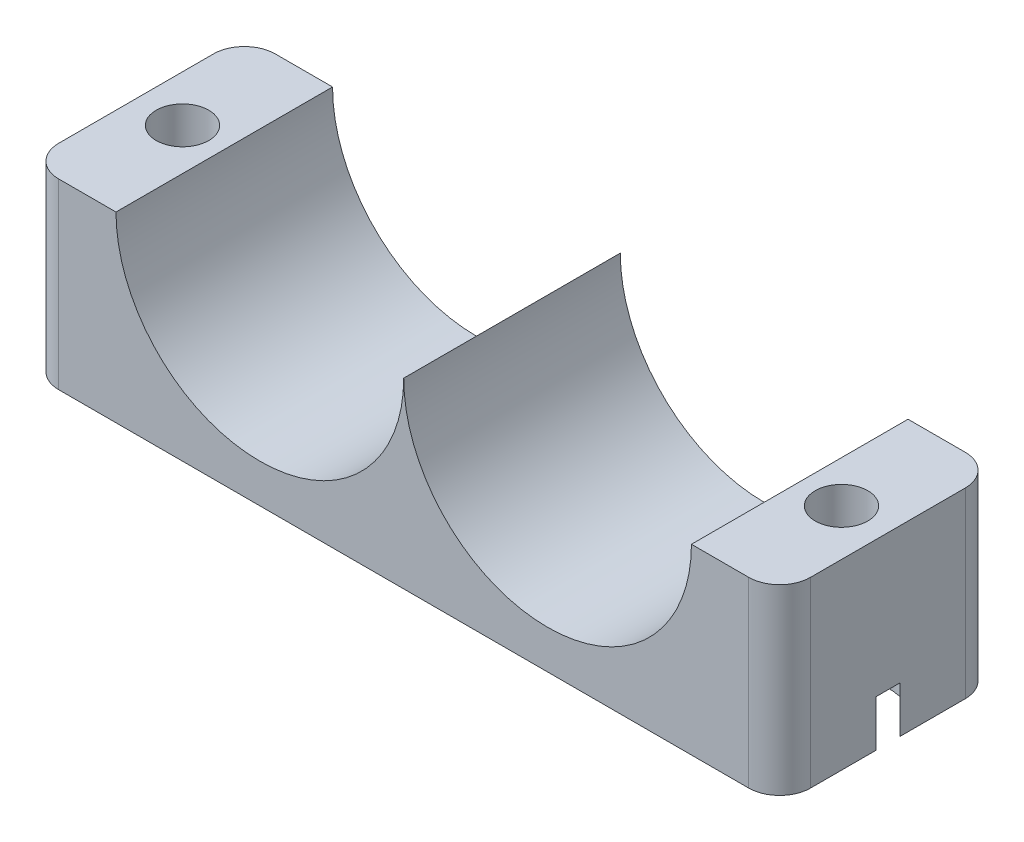
ISO-10303-21;
HEADER;
FILE_DESCRIPTION(('STEP AP214'),'2;1');
FILE_NAME('part.step','',(''),(''),'','','');
FILE_SCHEMA(('AUTOMOTIVE_DESIGN { 1 0 10303 214 1 1 1 1 }'));
ENDSEC;
DATA;
#1=APPLICATION_CONTEXT('core data for automotive mechanical design processes');
#2=APPLICATION_PROTOCOL_DEFINITION('international standard','automotive_design',2000,#1);
#3=PRODUCT_CONTEXT('',#1,'mechanical');
#4=PRODUCT('Part','Part','',(#3));
#5=PRODUCT_RELATED_PRODUCT_CATEGORY('part','',(#4));
#6=PRODUCT_DEFINITION_FORMATION('','',#4);
#7=PRODUCT_DEFINITION_CONTEXT('part definition',#1,'design');
#8=PRODUCT_DEFINITION('design','',#6,#7);
#9=PRODUCT_DEFINITION_SHAPE('','',#8);
#10=(LENGTH_UNIT() NAMED_UNIT(*) SI_UNIT(.MILLI.,.METRE.));
#11=(NAMED_UNIT(*) PLANE_ANGLE_UNIT() SI_UNIT($,.RADIAN.));
#12=(NAMED_UNIT(*) SI_UNIT($,.STERADIAN.) SOLID_ANGLE_UNIT());
#13=UNCERTAINTY_MEASURE_WITH_UNIT(LENGTH_MEASURE(1.E-05),#10,'distance_accuracy_value','');
#14=(GEOMETRIC_REPRESENTATION_CONTEXT(3) GLOBAL_UNCERTAINTY_ASSIGNED_CONTEXT((#13)) GLOBAL_UNIT_ASSIGNED_CONTEXT((#10,
#11,#12)) REPRESENTATION_CONTEXT('',''));
#15=CARTESIAN_POINT('',(0.,0.,0.));
#16=DIRECTION('',(0.,0.,1.));
#17=DIRECTION('',(1.,0.,0.));
#18=AXIS2_PLACEMENT_3D('',#15,#16,#17);
#19=CARTESIAN_POINT('',(158.1,491.59,478.72));
#20=DIRECTION('',(0.,-1.,0.));
#21=DIRECTION('',(1.,0.,0.));
#22=AXIS2_PLACEMENT_3D('',#19,#20,#21);
#23=CYLINDRICAL_SURFACE('',#22,1.7);
#24=DIRECTION('',(0.,1.,0.));
#25=VECTOR('',#24,1.);
#26=CARTESIAN_POINT('',(159.8,491.59,478.72));
#27=LINE('',#26,#25);
#28=CARTESIAN_POINT('',(159.8,495.59,478.72));
#29=VERTEX_POINT('',#28);
#30=CARTESIAN_POINT('',(159.8,504.39,478.72));
#31=VERTEX_POINT('',#30);
#32=EDGE_CURVE('E9',#29,#31,#27,.T.);
#33=ORIENTED_EDGE('',*,*,#32,.T.);
#34=CARTESIAN_POINT('',(158.1,504.39,478.72));
#35=DIRECTION('',(0.,-1.,0.));
#36=DIRECTION('',(1.,0.,0.));
#37=AXIS2_PLACEMENT_3D('',#34,#35,#36);
#38=CIRCLE('',#37,1.7);
#39=EDGE_CURVE('E232',#31,#31,#38,.T.);
#40=ORIENTED_EDGE('',*,*,#39,.F.);
#41=ORIENTED_EDGE('',*,*,#32,.F.);
#42=CARTESIAN_POINT('',(158.1,495.59,478.72));
#43=DIRECTION('',(0.,-1.,0.));
#44=DIRECTION('',(1.,0.,0.));
#45=AXIS2_PLACEMENT_3D('',#42,#43,#44);
#46=CIRCLE('',#45,1.7);
#47=EDGE_CURVE('E24',#29,#29,#46,.T.);
#48=ORIENTED_EDGE('',*,*,#47,.T.);
#49=EDGE_LOOP('',(#33,#40,#41,#48));
#50=FACE_BOUND('',#49,.T.);
#51=ADVANCED_FACE('F15',(#50),#23,.F.);
#52=CARTESIAN_POINT('',(158.1,495.59,478.72));
#53=DIRECTION('',(0.,-1.,0.));
#54=DIRECTION('',(0.,0.,-1.));
#55=AXIS2_PLACEMENT_3D('',#52,#53,#54);
#56=PLANE('',#55);
#57=ORIENTED_EDGE('',*,*,#47,.F.);
#58=EDGE_LOOP('',(#57));
#59=FACE_BOUND('',#58,.T.);
#60=DIRECTION('',(0.,0.,-1.));
#61=VECTOR('',#60,1.);
#62=CARTESIAN_POINT('',(161.1,495.59,475.22));
#63=LINE('',#62,#61);
#64=CARTESIAN_POINT('',(161.1,495.59,479.50102496759));
#65=VERTEX_POINT('',#64);
#66=CARTESIAN_POINT('',(161.1,495.59,477.9389750324));
#67=VERTEX_POINT('',#66);
#68=EDGE_CURVE('E183',#65,#67,#63,.T.);
#69=ORIENTED_EDGE('',*,*,#68,.F.);
#70=CARTESIAN_POINT('',(158.1,495.59,478.72));
#71=DIRECTION('',(0.,-1.,0.));
#72=DIRECTION('',(1.,0.,0.));
#73=AXIS2_PLACEMENT_3D('',#70,#71,#72);
#74=CIRCLE('',#73,3.1);
#75=EDGE_CURVE('E222',#65,#67,#74,.T.);
#76=ORIENTED_EDGE('',*,*,#75,.T.);
#77=EDGE_LOOP('',(#69,#76));
#78=FACE_BOUND('',#77,.T.);
#79=ADVANCED_FACE('F250',(#59,#78),#56,.T.);
#80=CARTESIAN_POINT('',(112.5,504.39,471.72));
#81=DIRECTION('',(0.,1.,0.));
#82=DIRECTION('',(1.,0.,0.));
#83=AXIS2_PLACEMENT_3D('',#80,#81,#82);
#84=PLANE('',#83);
#85=ORIENTED_EDGE('',*,*,#39,.T.);
#86=EDGE_LOOP('',(#85));
#87=FACE_BOUND('',#86,.T.);
#88=DIRECTION('',(1.,0.,0.));
#89=VECTOR('',#88,1.);
#90=CARTESIAN_POINT('',(112.5,504.39,471.72));
#91=LINE('',#90,#89);
#92=CARTESIAN_POINT('',(155.4,504.39,471.72));
#93=VERTEX_POINT('',#92);
#94=CARTESIAN_POINT('',(159.1,504.39,471.72));
#95=VERTEX_POINT('',#94);
#96=EDGE_CURVE('E155',#93,#95,#91,.T.);
#97=ORIENTED_EDGE('',*,*,#96,.F.);
#98=DIRECTION('',(0.,0.,1.));
#99=VECTOR('',#98,1.);
#100=CARTESIAN_POINT('',(155.4,504.39,464.72));
#101=LINE('',#100,#99);
#102=CARTESIAN_POINT('',(155.4,504.39,485.72));
#103=VERTEX_POINT('',#102);
#104=EDGE_CURVE('E86',#93,#103,#101,.T.);
#105=ORIENTED_EDGE('',*,*,#104,.T.);
#106=DIRECTION('',(1.,0.,0.));
#107=VECTOR('',#106,1.);
#108=CARTESIAN_POINT('',(112.5,504.39,485.72));
#109=LINE('',#108,#107);
#110=CARTESIAN_POINT('',(159.1,504.39,485.72));
#111=VERTEX_POINT('',#110);
#112=EDGE_CURVE('E81',#103,#111,#109,.T.);
#113=ORIENTED_EDGE('',*,*,#112,.T.);
#114=CARTESIAN_POINT('',(159.1,504.39,483.72));
#115=DIRECTION('',(0.,-1.,0.));
#116=DIRECTION('',(0.,0.,1.));
#117=AXIS2_PLACEMENT_3D('',#114,#115,#116);
#118=CIRCLE('',#117,2.);
#119=CARTESIAN_POINT('',(161.1,504.39,483.72));
#120=VERTEX_POINT('',#119);
#121=EDGE_CURVE('E225',#120,#111,#118,.T.);
#122=ORIENTED_EDGE('',*,*,#121,.F.);
#123=DIRECTION('',(0.,0.,1.));
#124=VECTOR('',#123,1.);
#125=CARTESIAN_POINT('',(161.1,504.39,471.72));
#126=LINE('',#125,#124);
#127=CARTESIAN_POINT('',(161.1,504.39,473.72));
#128=VERTEX_POINT('',#127);
#129=EDGE_CURVE('E197',#128,#120,#126,.T.);
#130=ORIENTED_EDGE('',*,*,#129,.F.);
#131=CARTESIAN_POINT('',(159.1,504.39,473.72));
#132=DIRECTION('',(0.,1.,0.));
#133=DIRECTION('',(0.,0.,1.));
#134=AXIS2_PLACEMENT_3D('',#131,#132,#133);
#135=CIRCLE('',#134,2.);
#136=EDGE_CURVE('E209',#128,#95,#135,.T.);
#137=ORIENTED_EDGE('',*,*,#136,.T.);
#138=EDGE_LOOP('',(#97,#105,#113,#122,#130,#137));
#139=FACE_BOUND('',#138,.T.);
#140=ADVANCED_FACE('F247',(#87,#139),#84,.T.);
#141=CARTESIAN_POINT('',(146.1,504.39,464.72));
#142=DIRECTION('',(0.,0.,-1.));
#143=DIRECTION('',(1.,0.,0.));
#144=AXIS2_PLACEMENT_3D('',#141,#142,#143);
#145=CYLINDRICAL_SURFACE('',#144,9.3);
#146=ORIENTED_EDGE('',*,*,#104,.F.);
#147=CARTESIAN_POINT('',(146.1,504.39,471.72));
#148=DIRECTION('',(0.,0.,-1.));
#149=DIRECTION('',(1.,0.,0.));
#150=AXIS2_PLACEMENT_3D('',#147,#148,#149);
#151=CIRCLE('',#150,9.3);
#152=CARTESIAN_POINT('',(136.8,504.39,471.72));
#153=VERTEX_POINT('',#152);
#154=EDGE_CURVE('E206',#93,#153,#151,.T.);
#155=ORIENTED_EDGE('',*,*,#154,.T.);
#156=DIRECTION('',(0.,0.,1.));
#157=VECTOR('',#156,1.);
#158=CARTESIAN_POINT('',(136.8,504.39,464.72));
#159=LINE('',#158,#157);
#160=CARTESIAN_POINT('',(136.8,504.39,485.72));
#161=VERTEX_POINT('',#160);
#162=EDGE_CURVE('E96',#153,#161,#159,.T.);
#163=ORIENTED_EDGE('',*,*,#162,.T.);
#164=CARTESIAN_POINT('',(146.1,504.39,485.72));
#165=DIRECTION('',(0.,0.,-1.));
#166=DIRECTION('',(1.,0.,0.));
#167=AXIS2_PLACEMENT_3D('',#164,#165,#166);
#168=CIRCLE('',#167,9.3);
#169=EDGE_CURVE('E235',#103,#161,#168,.T.);
#170=ORIENTED_EDGE('',*,*,#169,.F.);
#171=EDGE_LOOP('',(#146,#155,#163,#170));
#172=FACE_BOUND('',#171,.T.);
#173=ADVANCED_FACE('F410',(#172),#145,.F.);
#174=CARTESIAN_POINT('',(127.5,504.39,464.72));
#175=DIRECTION('',(0.,0.,-1.));
#176=DIRECTION('',(1.,0.,0.));
#177=AXIS2_PLACEMENT_3D('',#174,#175,#176);
#178=CYLINDRICAL_SURFACE('',#177,9.3);
#179=ORIENTED_EDGE('',*,*,#162,.F.);
#180=CARTESIAN_POINT('',(127.5,504.39,471.72));
#181=DIRECTION('',(0.,0.,-1.));
#182=DIRECTION('',(1.,0.,0.));
#183=AXIS2_PLACEMENT_3D('',#180,#181,#182);
#184=CIRCLE('',#183,9.3);
#185=CARTESIAN_POINT('',(118.2,504.39,471.72));
#186=VERTEX_POINT('',#185);
#187=EDGE_CURVE('E135',#153,#186,#184,.T.);
#188=ORIENTED_EDGE('',*,*,#187,.T.);
#189=DIRECTION('',(0.,0.,-1.));
#190=VECTOR('',#189,1.);
#191=CARTESIAN_POINT('',(118.2,504.39,464.72));
#192=LINE('',#191,#190);
#193=CARTESIAN_POINT('',(118.2,504.39,485.72));
#194=VERTEX_POINT('',#193);
#195=EDGE_CURVE('E173',#194,#186,#192,.T.);
#196=ORIENTED_EDGE('',*,*,#195,.F.);
#197=CARTESIAN_POINT('',(127.5,504.39,485.72));
#198=DIRECTION('',(0.,0.,-1.));
#199=DIRECTION('',(1.,0.,0.));
#200=AXIS2_PLACEMENT_3D('',#197,#198,#199);
#201=CIRCLE('',#200,9.3);
#202=EDGE_CURVE('E239',#161,#194,#201,.T.);
#203=ORIENTED_EDGE('',*,*,#202,.F.);
#204=EDGE_LOOP('',(#179,#188,#196,#203));
#205=FACE_BOUND('',#204,.T.);
#206=ADVANCED_FACE('F408',(#205),#178,.F.);
#207=CARTESIAN_POINT('',(115.5,491.59,478.72));
#208=DIRECTION('',(0.,-1.,0.));
#209=DIRECTION('',(1.,0.,0.));
#210=AXIS2_PLACEMENT_3D('',#207,#208,#209);
#211=CYLINDRICAL_SURFACE('',#210,1.7);
#212=DIRECTION('',(0.,1.,0.));
#213=VECTOR('',#212,1.);
#214=CARTESIAN_POINT('',(117.2,491.59,478.72));
#215=LINE('',#214,#213);
#216=CARTESIAN_POINT('',(117.2,495.59,478.72));
#217=VERTEX_POINT('',#216);
#218=CARTESIAN_POINT('',(117.2,504.39,478.72));
#219=VERTEX_POINT('',#218);
#220=EDGE_CURVE('E349',#217,#219,#215,.T.);
#221=ORIENTED_EDGE('',*,*,#220,.T.);
#222=CARTESIAN_POINT('',(115.5,504.39,478.72));
#223=DIRECTION('',(0.,-1.,0.));
#224=DIRECTION('',(1.,0.,0.));
#225=AXIS2_PLACEMENT_3D('',#222,#223,#224);
#226=CIRCLE('',#225,1.7);
#227=EDGE_CURVE('E156',#219,#219,#226,.T.);
#228=ORIENTED_EDGE('',*,*,#227,.F.);
#229=ORIENTED_EDGE('',*,*,#220,.F.);
#230=CARTESIAN_POINT('',(115.5,495.59,478.72));
#231=DIRECTION('',(0.,-1.,0.));
#232=DIRECTION('',(1.,0.,0.));
#233=AXIS2_PLACEMENT_3D('',#230,#231,#232);
#234=CIRCLE('',#233,1.7);
#235=EDGE_CURVE('E380',#217,#217,#234,.T.);
#236=ORIENTED_EDGE('',*,*,#235,.T.);
#237=EDGE_LOOP('',(#221,#228,#229,#236));
#238=FACE_BOUND('',#237,.T.);
#239=ADVANCED_FACE('F472',(#238),#211,.F.);
#240=CARTESIAN_POINT('',(112.5,492.59,485.72));
#241=DIRECTION('',(0.,0.,1.));
#242=DIRECTION('',(1.,0.,0.));
#243=AXIS2_PLACEMENT_3D('',#240,#241,#242);
#244=PLANE('',#243);
#245=ORIENTED_EDGE('',*,*,#169,.T.);
#246=ORIENTED_EDGE('',*,*,#202,.T.);
#247=DIRECTION('',(1.,0.,0.));
#248=VECTOR('',#247,1.);
#249=CARTESIAN_POINT('',(112.5,504.39,485.72));
#250=LINE('',#249,#248);
#251=CARTESIAN_POINT('',(114.5,504.39,485.72));
#252=VERTEX_POINT('',#251);
#253=EDGE_CURVE('E169',#252,#194,#250,.T.);
#254=ORIENTED_EDGE('',*,*,#253,.F.);
#255=DIRECTION('',(0.,1.,0.));
#256=VECTOR('',#255,1.);
#257=CARTESIAN_POINT('',(114.5,492.59,485.72));
#258=LINE('',#257,#256);
#259=CARTESIAN_POINT('',(114.5,492.59,485.72));
#260=VERTEX_POINT('',#259);
#261=EDGE_CURVE('E398',#260,#252,#258,.T.);
#262=ORIENTED_EDGE('',*,*,#261,.F.);
#263=DIRECTION('',(1.,0.,0.));
#264=VECTOR('',#263,1.);
#265=CARTESIAN_POINT('',(112.5,492.59,485.72));
#266=LINE('',#265,#264);
#267=CARTESIAN_POINT('',(159.1,492.59,485.72));
#268=VERTEX_POINT('',#267);
#269=EDGE_CURVE('E353',#260,#268,#266,.T.);
#270=ORIENTED_EDGE('',*,*,#269,.T.);
#271=DIRECTION('',(0.,1.,0.));
#272=VECTOR('',#271,1.);
#273=CARTESIAN_POINT('',(159.1,492.59,485.72));
#274=LINE('',#273,#272);
#275=EDGE_CURVE('E229',#268,#111,#274,.T.);
#276=ORIENTED_EDGE('',*,*,#275,.T.);
#277=ORIENTED_EDGE('',*,*,#112,.F.);
#278=EDGE_LOOP('',(#245,#246,#254,#262,#270,#276,#277));
#279=FACE_BOUND('',#278,.T.);
#280=ADVANCED_FACE('F407',(#279),#244,.T.);
#281=CARTESIAN_POINT('',(159.1,492.59,483.72));
#282=DIRECTION('',(0.,1.,0.));
#283=DIRECTION('',(1.,0.,0.));
#284=AXIS2_PLACEMENT_3D('',#281,#282,#283);
#285=CYLINDRICAL_SURFACE('',#284,2.);
#286=DIRECTION('',(0.,1.,0.));
#287=VECTOR('',#286,1.);
#288=CARTESIAN_POINT('',(161.1,492.59,483.72));
#289=LINE('',#288,#287);
#290=CARTESIAN_POINT('',(161.1,492.59,483.72));
#291=VERTEX_POINT('',#290);
#292=EDGE_CURVE('E193',#291,#120,#289,.T.);
#293=ORIENTED_EDGE('',*,*,#292,.T.);
#294=ORIENTED_EDGE('',*,*,#121,.T.);
#295=ORIENTED_EDGE('',*,*,#275,.F.);
#296=CARTESIAN_POINT('',(159.1,492.59,483.72));
#297=DIRECTION('',(0.,-1.,0.));
#298=DIRECTION('',(0.,0.,1.));
#299=AXIS2_PLACEMENT_3D('',#296,#297,#298);
#300=CIRCLE('',#299,2.);
#301=EDGE_CURVE('E365',#291,#268,#300,.T.);
#302=ORIENTED_EDGE('',*,*,#301,.F.);
#303=EDGE_LOOP('',(#293,#294,#295,#302));
#304=FACE_BOUND('',#303,.T.);
#305=ADVANCED_FACE('F488',(#304),#285,.T.);
#306=CARTESIAN_POINT('',(158.1,491.59,478.72));
#307=DIRECTION('',(0.,-1.,0.));
#308=DIRECTION('',(1.,0.,0.));
#309=AXIS2_PLACEMENT_3D('',#306,#307,#308);
#310=CYLINDRICAL_SURFACE('',#309,3.1);
#311=CARTESIAN_POINT('',(158.1,492.59,478.72));
#312=DIRECTION('',(0.,-1.,0.));
#313=DIRECTION('',(1.,0.,0.));
#314=AXIS2_PLACEMENT_3D('',#311,#312,#313);
#315=CIRCLE('',#314,3.1);
#316=CARTESIAN_POINT('',(161.1,492.59,479.50102496761));
#317=VERTEX_POINT('',#316);
#318=CARTESIAN_POINT('',(161.1,492.59,477.93897503238));
#319=VERTEX_POINT('',#318);
#320=EDGE_CURVE('E267',#317,#319,#315,.T.);
#321=ORIENTED_EDGE('',*,*,#320,.T.);
#322=DIRECTION('',(0.,-1.,0.));
#323=VECTOR('',#322,1.);
#324=CARTESIAN_POINT('',(161.1,491.59,477.9389750324));
#325=LINE('',#324,#323);
#326=EDGE_CURVE('E185',#67,#319,#325,.T.);
#327=ORIENTED_EDGE('',*,*,#326,.F.);
#328=ORIENTED_EDGE('',*,*,#75,.F.);
#329=DIRECTION('',(0.,-1.,0.));
#330=VECTOR('',#329,1.);
#331=CARTESIAN_POINT('',(161.1,491.59,479.50102496759));
#332=LINE('',#331,#330);
#333=EDGE_CURVE('E186',#65,#317,#332,.T.);
#334=ORIENTED_EDGE('',*,*,#333,.T.);
#335=EDGE_LOOP('',(#321,#327,#328,#334));
#336=FACE_BOUND('',#335,.T.);
#337=ADVANCED_FACE('F265',(#336),#310,.F.);
#338=CARTESIAN_POINT('',(161.1,492.59,471.72));
#339=DIRECTION('',(1.,0.,0.));
#340=DIRECTION('',(0.,1.,0.));
#341=AXIS2_PLACEMENT_3D('',#338,#339,#340);
#342=PLANE('',#341);
#343=DIRECTION('',(0.,0.,1.));
#344=VECTOR('',#343,1.);
#345=CARTESIAN_POINT('',(161.1,492.59,471.72));
#346=LINE('',#345,#344);
#347=CARTESIAN_POINT('',(161.1,492.59,473.72));
#348=VERTEX_POINT('',#347);
#349=EDGE_CURVE('E358',#348,#319,#346,.T.);
#350=ORIENTED_EDGE('',*,*,#349,.F.);
#351=DIRECTION('',(0.,1.,0.));
#352=VECTOR('',#351,1.);
#353=CARTESIAN_POINT('',(161.1,492.59,473.72));
#354=LINE('',#353,#352);
#355=EDGE_CURVE('E212',#348,#128,#354,.T.);
#356=ORIENTED_EDGE('',*,*,#355,.T.);
#357=ORIENTED_EDGE('',*,*,#129,.T.);
#358=ORIENTED_EDGE('',*,*,#292,.F.);
#359=DIRECTION('',(0.,0.,1.));
#360=VECTOR('',#359,1.);
#361=CARTESIAN_POINT('',(161.1,492.59,471.72));
#362=LINE('',#361,#360);
#363=EDGE_CURVE('E261',#317,#291,#362,.T.);
#364=ORIENTED_EDGE('',*,*,#363,.F.);
#365=ORIENTED_EDGE('',*,*,#333,.F.);
#366=ORIENTED_EDGE('',*,*,#68,.T.);
#367=ORIENTED_EDGE('',*,*,#326,.T.);
#368=EDGE_LOOP('',(#350,#356,#357,#358,#364,#365,#366,#367));
#369=FACE_BOUND('',#368,.T.);
#370=ADVANCED_FACE('F259',(#369),#342,.T.);
#371=CARTESIAN_POINT('',(159.1,492.59,473.72));
#372=DIRECTION('',(0.,1.,0.));
#373=DIRECTION('',(1.,0.,0.));
#374=AXIS2_PLACEMENT_3D('',#371,#372,#373);
#375=CYLINDRICAL_SURFACE('',#374,2.);
#376=CARTESIAN_POINT('',(159.1,492.59,473.72));
#377=DIRECTION('',(0.,1.,0.));
#378=DIRECTION('',(0.,0.,1.));
#379=AXIS2_PLACEMENT_3D('',#376,#377,#378);
#380=CIRCLE('',#379,2.);
#381=CARTESIAN_POINT('',(159.1,492.59,471.72));
#382=VERTEX_POINT('',#381);
#383=EDGE_CURVE('E354',#348,#382,#380,.T.);
#384=ORIENTED_EDGE('',*,*,#383,.T.);
#385=DIRECTION('',(0.,1.,0.));
#386=VECTOR('',#385,1.);
#387=CARTESIAN_POINT('',(159.1,492.59,471.72));
#388=LINE('',#387,#386);
#389=EDGE_CURVE('E200',#382,#95,#388,.T.);
#390=ORIENTED_EDGE('',*,*,#389,.T.);
#391=ORIENTED_EDGE('',*,*,#136,.F.);
#392=ORIENTED_EDGE('',*,*,#355,.F.);
#393=EDGE_LOOP('',(#384,#390,#391,#392));
#394=FACE_BOUND('',#393,.T.);
#395=ADVANCED_FACE('F413',(#394),#375,.T.);
#396=CARTESIAN_POINT('',(112.5,492.59,471.72));
#397=DIRECTION('',(0.,0.,1.));
#398=DIRECTION('',(1.,0.,0.));
#399=AXIS2_PLACEMENT_3D('',#396,#397,#398);
#400=PLANE('',#399);
#401=ORIENTED_EDGE('',*,*,#96,.T.);
#402=ORIENTED_EDGE('',*,*,#389,.F.);
#403=DIRECTION('',(1.,0.,0.));
#404=VECTOR('',#403,1.);
#405=CARTESIAN_POINT('',(112.5,492.59,471.72));
#406=LINE('',#405,#404);
#407=CARTESIAN_POINT('',(114.5,492.59,471.72));
#408=VERTEX_POINT('',#407);
#409=EDGE_CURVE('E150',#408,#382,#406,.T.);
#410=ORIENTED_EDGE('',*,*,#409,.F.);
#411=DIRECTION('',(0.,1.,0.));
#412=VECTOR('',#411,1.);
#413=CARTESIAN_POINT('',(114.5,492.59,471.72));
#414=LINE('',#413,#412);
#415=CARTESIAN_POINT('',(114.5,504.39,471.72));
#416=VERTEX_POINT('',#415);
#417=EDGE_CURVE('E141',#408,#416,#414,.T.);
#418=ORIENTED_EDGE('',*,*,#417,.T.);
#419=DIRECTION('',(1.,0.,0.));
#420=VECTOR('',#419,1.);
#421=CARTESIAN_POINT('',(112.5,504.39,471.72));
#422=LINE('',#421,#420);
#423=EDGE_CURVE('E146',#416,#186,#422,.T.);
#424=ORIENTED_EDGE('',*,*,#423,.T.);
#425=ORIENTED_EDGE('',*,*,#187,.F.);
#426=ORIENTED_EDGE('',*,*,#154,.F.);
#427=EDGE_LOOP('',(#401,#402,#410,#418,#424,#425,#426));
#428=FACE_BOUND('',#427,.T.);
#429=ADVANCED_FACE('F144',(#428),#400,.F.);
#430=CARTESIAN_POINT('',(114.5,492.59,473.72));
#431=DIRECTION('',(0.,1.,0.));
#432=DIRECTION('',(-1.,0.,0.));
#433=AXIS2_PLACEMENT_3D('',#430,#431,#432);
#434=CYLINDRICAL_SURFACE('',#433,2.);
#435=DIRECTION('',(0.,1.,0.));
#436=VECTOR('',#435,1.);
#437=CARTESIAN_POINT('',(112.5,492.59,473.72));
#438=LINE('',#437,#436);
#439=CARTESIAN_POINT('',(112.5,492.59,473.72));
#440=VERTEX_POINT('',#439);
#441=CARTESIAN_POINT('',(112.5,504.39,473.72));
#442=VERTEX_POINT('',#441);
#443=EDGE_CURVE('E164',#440,#442,#438,.T.);
#444=ORIENTED_EDGE('',*,*,#443,.T.);
#445=CARTESIAN_POINT('',(114.5,504.39,473.72));
#446=DIRECTION('',(0.,-1.,0.));
#447=DIRECTION('',(0.,0.,1.));
#448=AXIS2_PLACEMENT_3D('',#445,#446,#447);
#449=CIRCLE('',#448,2.);
#450=EDGE_CURVE('E160',#442,#416,#449,.T.);
#451=ORIENTED_EDGE('',*,*,#450,.T.);
#452=ORIENTED_EDGE('',*,*,#417,.F.);
#453=CARTESIAN_POINT('',(114.5,492.59,473.72));
#454=DIRECTION('',(0.,-1.,0.));
#455=DIRECTION('',(0.,0.,1.));
#456=AXIS2_PLACEMENT_3D('',#453,#454,#455);
#457=CIRCLE('',#456,2.);
#458=EDGE_CURVE('E295',#440,#408,#457,.T.);
#459=ORIENTED_EDGE('',*,*,#458,.F.);
#460=EDGE_LOOP('',(#444,#451,#452,#459));
#461=FACE_BOUND('',#460,.T.);
#462=ADVANCED_FACE('F161',(#461),#434,.T.);
#463=CARTESIAN_POINT('',(112.5,504.39,471.72));
#464=DIRECTION('',(0.,1.,0.));
#465=DIRECTION('',(1.,0.,0.));
#466=AXIS2_PLACEMENT_3D('',#463,#464,#465);
#467=PLANE('',#466);
#468=ORIENTED_EDGE('',*,*,#227,.T.);
#469=EDGE_LOOP('',(#468));
#470=FACE_BOUND('',#469,.T.);
#471=ORIENTED_EDGE('',*,*,#195,.T.);
#472=ORIENTED_EDGE('',*,*,#423,.F.);
#473=ORIENTED_EDGE('',*,*,#450,.F.);
#474=DIRECTION('',(0.,0.,1.));
#475=VECTOR('',#474,1.);
#476=CARTESIAN_POINT('',(112.5,504.39,471.72));
#477=LINE('',#476,#475);
#478=CARTESIAN_POINT('',(112.5,504.39,483.72));
#479=VERTEX_POINT('',#478);
#480=EDGE_CURVE('E362',#442,#479,#477,.T.);
#481=ORIENTED_EDGE('',*,*,#480,.T.);
#482=CARTESIAN_POINT('',(114.5,504.39,483.72));
#483=DIRECTION('',(0.,1.,0.));
#484=DIRECTION('',(0.,0.,1.));
#485=AXIS2_PLACEMENT_3D('',#482,#483,#484);
#486=CIRCLE('',#485,2.);
#487=EDGE_CURVE('E179',#479,#252,#486,.T.);
#488=ORIENTED_EDGE('',*,*,#487,.T.);
#489=ORIENTED_EDGE('',*,*,#253,.T.);
#490=EDGE_LOOP('',(#471,#472,#473,#481,#488,#489));
#491=FACE_BOUND('',#490,.T.);
#492=ADVANCED_FACE('F171',(#470,#491),#467,.T.);
#493=CARTESIAN_POINT('',(114.5,492.59,483.72));
#494=DIRECTION('',(0.,1.,0.));
#495=DIRECTION('',(-1.,0.,0.));
#496=AXIS2_PLACEMENT_3D('',#493,#494,#495);
#497=CYLINDRICAL_SURFACE('',#496,2.);
#498=CARTESIAN_POINT('',(114.5,492.59,483.72));
#499=DIRECTION('',(0.,1.,0.));
#500=DIRECTION('',(0.,0.,1.));
#501=AXIS2_PLACEMENT_3D('',#498,#499,#500);
#502=CIRCLE('',#501,2.);
#503=CARTESIAN_POINT('',(112.5,492.59,483.72));
#504=VERTEX_POINT('',#503);
#505=EDGE_CURVE('E324',#504,#260,#502,.T.);
#506=ORIENTED_EDGE('',*,*,#505,.T.);
#507=ORIENTED_EDGE('',*,*,#261,.T.);
#508=ORIENTED_EDGE('',*,*,#487,.F.);
#509=DIRECTION('',(0.,1.,0.));
#510=VECTOR('',#509,1.);
#511=CARTESIAN_POINT('',(112.5,492.59,483.72));
#512=LINE('',#511,#510);
#513=EDGE_CURVE('E336',#504,#479,#512,.T.);
#514=ORIENTED_EDGE('',*,*,#513,.F.);
#515=EDGE_LOOP('',(#506,#507,#508,#514));
#516=FACE_BOUND('',#515,.T.);
#517=ADVANCED_FACE('F405',(#516),#497,.T.);
#518=CARTESIAN_POINT('',(115.5,495.59,478.72));
#519=DIRECTION('',(0.,-1.,0.));
#520=DIRECTION('',(0.,0.,-1.));
#521=AXIS2_PLACEMENT_3D('',#518,#519,#520);
#522=PLANE('',#521);
#523=ORIENTED_EDGE('',*,*,#235,.F.);
#524=EDGE_LOOP('',(#523));
#525=FACE_BOUND('',#524,.T.);
#526=DIRECTION('',(0.,0.,-1.));
#527=VECTOR('',#526,1.);
#528=CARTESIAN_POINT('',(112.5,495.59,475.22));
#529=LINE('',#528,#527);
#530=CARTESIAN_POINT('',(112.5,495.59,479.50102496759));
#531=VERTEX_POINT('',#530);
#532=CARTESIAN_POINT('',(112.5,495.59,477.9389750324));
#533=VERTEX_POINT('',#532);
#534=EDGE_CURVE('E340',#531,#533,#529,.T.);
#535=ORIENTED_EDGE('',*,*,#534,.T.);
#536=CARTESIAN_POINT('',(115.5,495.59,478.72));
#537=DIRECTION('',(0.,1.,0.));
#538=DIRECTION('',(-0.967741935483994,0.,0.251943537931998));
#539=AXIS2_PLACEMENT_3D('',#536,#537,#538);
#540=CIRCLE('',#539,3.1);
#541=EDGE_CURVE('E377',#531,#533,#540,.T.);
#542=ORIENTED_EDGE('',*,*,#541,.F.);
#543=EDGE_LOOP('',(#535,#542));
#544=FACE_BOUND('',#543,.T.);
#545=ADVANCED_FACE('F428',(#525,#544),#522,.T.);
#546=CARTESIAN_POINT('',(115.5,491.59,478.72));
#547=DIRECTION('',(0.,-1.,0.));
#548=DIRECTION('',(1.,0.,0.));
#549=AXIS2_PLACEMENT_3D('',#546,#547,#548);
#550=CYLINDRICAL_SURFACE('',#549,3.1);
#551=DIRECTION('',(0.,-1.,0.));
#552=VECTOR('',#551,1.);
#553=CARTESIAN_POINT('',(112.5,491.59,477.9389750324));
#554=LINE('',#553,#552);
#555=CARTESIAN_POINT('',(112.5,492.59,477.93897503241));
#556=VERTEX_POINT('',#555);
#557=EDGE_CURVE('E320',#533,#556,#554,.T.);
#558=ORIENTED_EDGE('',*,*,#557,.T.);
#559=CARTESIAN_POINT('',(115.5,492.59,478.72));
#560=DIRECTION('',(0.,1.,0.));
#561=DIRECTION('',(-0.967741935484546,0.,0.251943537929882));
#562=AXIS2_PLACEMENT_3D('',#559,#560,#561);
#563=CIRCLE('',#562,3.1);
#564=CARTESIAN_POINT('',(112.5,492.59,479.50102496758));
#565=VERTEX_POINT('',#564);
#566=EDGE_CURVE('E312',#565,#556,#563,.T.);
#567=ORIENTED_EDGE('',*,*,#566,.F.);
#568=DIRECTION('',(0.,-1.,0.));
#569=VECTOR('',#568,1.);
#570=CARTESIAN_POINT('',(112.5,491.59,479.50102496759));
#571=LINE('',#570,#569);
#572=EDGE_CURVE('E317',#531,#565,#571,.T.);
#573=ORIENTED_EDGE('',*,*,#572,.F.);
#574=ORIENTED_EDGE('',*,*,#541,.T.);
#575=EDGE_LOOP('',(#558,#567,#573,#574));
#576=FACE_BOUND('',#575,.T.);
#577=ADVANCED_FACE('F314',(#576),#550,.F.);
#578=CARTESIAN_POINT('',(112.5,492.59,471.72));
#579=DIRECTION('',(0.,1.,0.));
#580=DIRECTION('',(1.,0.,0.));
#581=AXIS2_PLACEMENT_3D('',#578,#579,#580);
#582=PLANE('',#581);
#583=ORIENTED_EDGE('',*,*,#383,.F.);
#584=ORIENTED_EDGE('',*,*,#349,.T.);
#585=ORIENTED_EDGE('',*,*,#320,.F.);
#586=ORIENTED_EDGE('',*,*,#363,.T.);
#587=ORIENTED_EDGE('',*,*,#301,.T.);
#588=ORIENTED_EDGE('',*,*,#269,.F.);
#589=ORIENTED_EDGE('',*,*,#505,.F.);
#590=DIRECTION('',(0.,0.,1.));
#591=VECTOR('',#590,1.);
#592=CARTESIAN_POINT('',(112.5,492.59,471.72));
#593=LINE('',#592,#591);
#594=EDGE_CURVE('E327',#565,#504,#593,.T.);
#595=ORIENTED_EDGE('',*,*,#594,.F.);
#596=ORIENTED_EDGE('',*,*,#566,.T.);
#597=DIRECTION('',(0.,0.,1.));
#598=VECTOR('',#597,1.);
#599=CARTESIAN_POINT('',(112.5,492.59,471.72));
#600=LINE('',#599,#598);
#601=EDGE_CURVE('E359',#440,#556,#600,.T.);
#602=ORIENTED_EDGE('',*,*,#601,.F.);
#603=ORIENTED_EDGE('',*,*,#458,.T.);
#604=ORIENTED_EDGE('',*,*,#409,.T.);
#605=EDGE_LOOP('',(#583,#584,#585,#586,#587,#588,#589,#595,#596,#602,#603,#604));
#606=FACE_BOUND('',#605,.T.);
#607=ADVANCED_FACE('F329',(#606),#582,.F.);
#608=CARTESIAN_POINT('',(112.5,492.59,471.72));
#609=DIRECTION('',(1.,0.,0.));
#610=DIRECTION('',(0.,1.,0.));
#611=AXIS2_PLACEMENT_3D('',#608,#609,#610);
#612=PLANE('',#611);
#613=ORIENTED_EDGE('',*,*,#557,.F.);
#614=ORIENTED_EDGE('',*,*,#534,.F.);
#615=ORIENTED_EDGE('',*,*,#572,.T.);
#616=ORIENTED_EDGE('',*,*,#594,.T.);
#617=ORIENTED_EDGE('',*,*,#513,.T.);
#618=ORIENTED_EDGE('',*,*,#480,.F.);
#619=ORIENTED_EDGE('',*,*,#443,.F.);
#620=ORIENTED_EDGE('',*,*,#601,.T.);
#621=EDGE_LOOP('',(#613,#614,#615,#616,#617,#618,#619,#620));
#622=FACE_BOUND('',#621,.T.);
#623=ADVANCED_FACE('F338',(#622),#612,.F.);
#624=CLOSED_SHELL('',(#51,#79,#140,#173,#206,#239,#280,#305,#337,#370,#395,#429,#462,#492,#517,
#545,#577,#607,#623));
#625=MANIFOLD_SOLID_BREP('B1',#624);
#626=ADVANCED_BREP_SHAPE_REPRESENTATION('',(#18,#625),#14);
#627=SHAPE_DEFINITION_REPRESENTATION(#9,#626);
ENDSEC;
END-ISO-10303-21;
